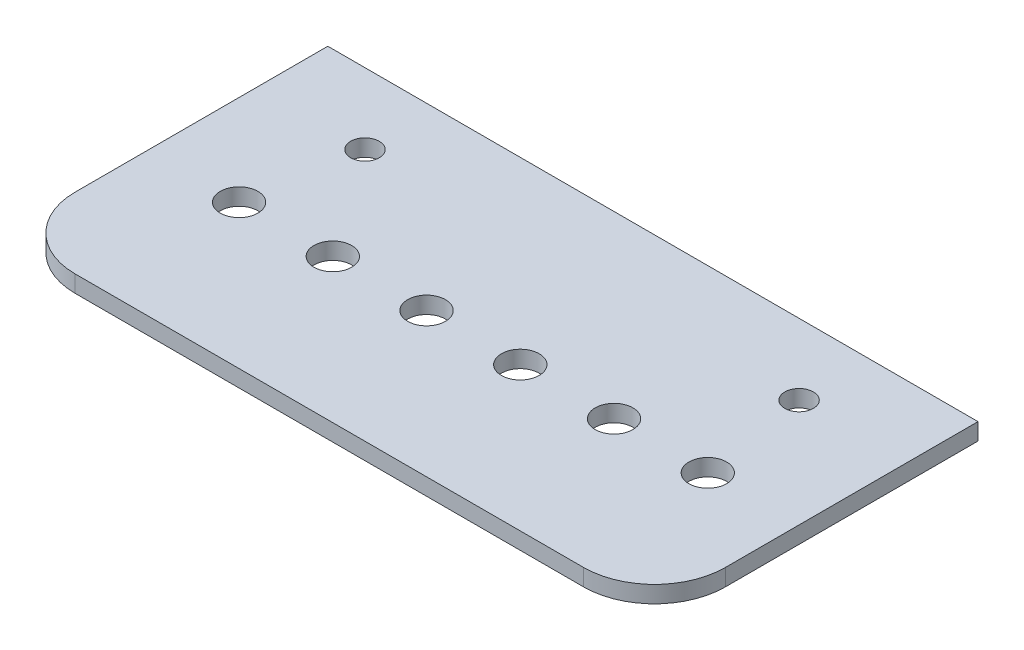
ISO-10303-21;
HEADER;
FILE_DESCRIPTION(('STEP AP214'),'2;1');
FILE_NAME('part.step','',(''),(''),'','','');
FILE_SCHEMA(('AUTOMOTIVE_DESIGN { 1 0 10303 214 1 1 1 1 }'));
ENDSEC;
DATA;
#1=APPLICATION_CONTEXT('core data for automotive mechanical design processes');
#2=APPLICATION_PROTOCOL_DEFINITION('international standard','automotive_design',2000,#1);
#3=PRODUCT_CONTEXT('',#1,'mechanical');
#4=PRODUCT('Part','Part','',(#3));
#5=PRODUCT_RELATED_PRODUCT_CATEGORY('part','',(#4));
#6=PRODUCT_DEFINITION_FORMATION('','',#4);
#7=PRODUCT_DEFINITION_CONTEXT('part definition',#1,'design');
#8=PRODUCT_DEFINITION('design','',#6,#7);
#9=PRODUCT_DEFINITION_SHAPE('','',#8);
#10=(LENGTH_UNIT() NAMED_UNIT(*) SI_UNIT(.MILLI.,.METRE.));
#11=(NAMED_UNIT(*) PLANE_ANGLE_UNIT() SI_UNIT($,.RADIAN.));
#12=(NAMED_UNIT(*) SI_UNIT($,.STERADIAN.) SOLID_ANGLE_UNIT());
#13=UNCERTAINTY_MEASURE_WITH_UNIT(LENGTH_MEASURE(1.E-05),#10,'distance_accuracy_value','');
#14=(GEOMETRIC_REPRESENTATION_CONTEXT(3) GLOBAL_UNCERTAINTY_ASSIGNED_CONTEXT((#13)) GLOBAL_UNIT_ASSIGNED_CONTEXT((#10,
#11,#12)) REPRESENTATION_CONTEXT('',''));
#15=CARTESIAN_POINT('',(0.,0.,0.));
#16=DIRECTION('',(0.,0.,1.));
#17=DIRECTION('',(1.,0.,0.));
#18=AXIS2_PLACEMENT_3D('',#15,#16,#17);
#19=CARTESIAN_POINT('',(44.475,2.95,-12.4));
#20=DIRECTION('',(0.,-1.,0.));
#21=DIRECTION('',(0.,0.,-1.));
#22=AXIS2_PLACEMENT_3D('',#19,#20,#21);
#23=CYLINDRICAL_SURFACE('',#22,12.4);
#24=CARTESIAN_POINT('',(44.475,0.,-12.4));
#25=DIRECTION('',(0.,1.,0.));
#26=DIRECTION('',(0.,0.,1.));
#27=AXIS2_PLACEMENT_3D('',#24,#25,#26);
#28=CIRCLE('',#27,12.4);
#29=CARTESIAN_POINT('',(44.475,0.,0.));
#30=VERTEX_POINT('',#29);
#31=CARTESIAN_POINT('',(56.875,0.,-12.4));
#32=VERTEX_POINT('',#31);
#33=EDGE_CURVE('E119',#30,#32,#28,.T.);
#34=ORIENTED_EDGE('',*,*,#33,.T.);
#35=DIRECTION('',(0.,-1.,0.));
#36=VECTOR('',#35,1.);
#37=CARTESIAN_POINT('',(56.875,2.95,-12.4));
#38=LINE('',#37,#36);
#39=CARTESIAN_POINT('',(56.875,2.95,-12.4));
#40=VERTEX_POINT('',#39);
#41=EDGE_CURVE('E11',#40,#32,#38,.T.);
#42=ORIENTED_EDGE('',*,*,#41,.F.);
#43=CARTESIAN_POINT('',(44.475,2.95,-12.4));
#44=DIRECTION('',(0.,1.,0.));
#45=DIRECTION('',(0.,0.,1.));
#46=AXIS2_PLACEMENT_3D('',#43,#44,#45);
#47=CIRCLE('',#46,12.4);
#48=CARTESIAN_POINT('',(44.475,2.95,0.));
#49=VERTEX_POINT('',#48);
#50=EDGE_CURVE('E130',#49,#40,#47,.T.);
#51=ORIENTED_EDGE('',*,*,#50,.F.);
#52=DIRECTION('',(0.,-1.,0.));
#53=VECTOR('',#52,1.);
#54=CARTESIAN_POINT('',(44.475,2.95,0.));
#55=LINE('',#54,#53);
#56=EDGE_CURVE('E115',#49,#30,#55,.T.);
#57=ORIENTED_EDGE('',*,*,#56,.T.);
#58=EDGE_LOOP('',(#34,#42,#51,#57));
#59=FACE_BOUND('',#58,.T.);
#60=ADVANCED_FACE('F35',(#59),#23,.T.);
#61=CARTESIAN_POINT('',(56.875,2.95,-12.4));
#62=DIRECTION('',(-1.,0.,0.));
#63=DIRECTION('',(0.,0.,1.));
#64=AXIS2_PLACEMENT_3D('',#61,#62,#63);
#65=PLANE('',#64);
#66=DIRECTION('',(0.,0.,-1.));
#67=VECTOR('',#66,1.);
#68=CARTESIAN_POINT('',(56.875,0.,-12.4));
#69=LINE('',#68,#67);
#70=CARTESIAN_POINT('',(56.875,0.,-56.6));
#71=VERTEX_POINT('',#70);
#72=EDGE_CURVE('E122',#32,#71,#69,.T.);
#73=ORIENTED_EDGE('',*,*,#72,.T.);
#74=DIRECTION('',(0.,-1.,0.));
#75=VECTOR('',#74,1.);
#76=CARTESIAN_POINT('',(56.875,2.95,-56.6));
#77=LINE('',#76,#75);
#78=CARTESIAN_POINT('',(56.875,2.95,-56.6));
#79=VERTEX_POINT('',#78);
#80=EDGE_CURVE('E43',#79,#71,#77,.T.);
#81=ORIENTED_EDGE('',*,*,#80,.F.);
#82=DIRECTION('',(0.,0.,-1.));
#83=VECTOR('',#82,1.);
#84=CARTESIAN_POINT('',(56.875,2.95,-12.4));
#85=LINE('',#84,#83);
#86=EDGE_CURVE('E88',#40,#79,#85,.T.);
#87=ORIENTED_EDGE('',*,*,#86,.F.);
#88=ORIENTED_EDGE('',*,*,#41,.T.);
#89=EDGE_LOOP('',(#73,#81,#87,#88));
#90=FACE_BOUND('',#89,.T.);
#91=ADVANCED_FACE('F155',(#90),#65,.F.);
#92=CARTESIAN_POINT('',(56.875,2.95,-56.6));
#93=DIRECTION('',(0.,0.,1.));
#94=DIRECTION('',(1.,0.,0.));
#95=AXIS2_PLACEMENT_3D('',#92,#93,#94);
#96=PLANE('',#95);
#97=DIRECTION('',(-1.,0.,0.));
#98=VECTOR('',#97,1.);
#99=CARTESIAN_POINT('',(56.875,0.,-56.6));
#100=LINE('',#99,#98);
#101=CARTESIAN_POINT('',(-56.875,0.,-56.6));
#102=VERTEX_POINT('',#101);
#103=EDGE_CURVE('E125',#71,#102,#100,.T.);
#104=ORIENTED_EDGE('',*,*,#103,.T.);
#105=DIRECTION('',(0.,-1.,0.));
#106=VECTOR('',#105,1.);
#107=CARTESIAN_POINT('',(-56.875,2.95,-56.6));
#108=LINE('',#107,#106);
#109=CARTESIAN_POINT('',(-56.875,2.95,-56.6));
#110=VERTEX_POINT('',#109);
#111=EDGE_CURVE('E110',#110,#102,#108,.T.);
#112=ORIENTED_EDGE('',*,*,#111,.F.);
#113=DIRECTION('',(-1.,0.,0.));
#114=VECTOR('',#113,1.);
#115=CARTESIAN_POINT('',(56.875,2.95,-56.6));
#116=LINE('',#115,#114);
#117=EDGE_CURVE('E101',#79,#110,#116,.T.);
#118=ORIENTED_EDGE('',*,*,#117,.F.);
#119=ORIENTED_EDGE('',*,*,#80,.T.);
#120=EDGE_LOOP('',(#104,#112,#118,#119));
#121=FACE_BOUND('',#120,.T.);
#122=ADVANCED_FACE('F136',(#121),#96,.F.);
#123=CARTESIAN_POINT('',(-56.875,2.95,-56.6));
#124=DIRECTION('',(1.,0.,0.));
#125=DIRECTION('',(0.,0.,-1.));
#126=AXIS2_PLACEMENT_3D('',#123,#124,#125);
#127=PLANE('',#126);
#128=DIRECTION('',(0.,0.,1.));
#129=VECTOR('',#128,1.);
#130=CARTESIAN_POINT('',(-56.875,0.,-56.6));
#131=LINE('',#130,#129);
#132=CARTESIAN_POINT('',(-56.875,0.,-12.4));
#133=VERTEX_POINT('',#132);
#134=EDGE_CURVE('E109',#102,#133,#131,.T.);
#135=ORIENTED_EDGE('',*,*,#134,.T.);
#136=DIRECTION('',(0.,-1.,0.));
#137=VECTOR('',#136,1.);
#138=CARTESIAN_POINT('',(-56.875,2.95,-12.4));
#139=LINE('',#138,#137);
#140=CARTESIAN_POINT('',(-56.875,2.95,-12.4));
#141=VERTEX_POINT('',#140);
#142=EDGE_CURVE('E106',#141,#133,#139,.T.);
#143=ORIENTED_EDGE('',*,*,#142,.F.);
#144=DIRECTION('',(0.,0.,1.));
#145=VECTOR('',#144,1.);
#146=CARTESIAN_POINT('',(-56.875,2.95,-56.6));
#147=LINE('',#146,#145);
#148=EDGE_CURVE('E95',#110,#141,#147,.T.);
#149=ORIENTED_EDGE('',*,*,#148,.F.);
#150=ORIENTED_EDGE('',*,*,#111,.T.);
#151=EDGE_LOOP('',(#135,#143,#149,#150));
#152=FACE_BOUND('',#151,.T.);
#153=ADVANCED_FACE('F107',(#152),#127,.F.);
#154=CARTESIAN_POINT('',(-44.475,2.95,-12.4));
#155=DIRECTION('',(0.,-1.,0.));
#156=DIRECTION('',(0.,0.,-1.));
#157=AXIS2_PLACEMENT_3D('',#154,#155,#156);
#158=CYLINDRICAL_SURFACE('',#157,12.4);
#159=CARTESIAN_POINT('',(-44.475,0.,-12.4));
#160=DIRECTION('',(0.,1.,0.));
#161=DIRECTION('',(0.,0.,1.));
#162=AXIS2_PLACEMENT_3D('',#159,#160,#161);
#163=CIRCLE('',#162,12.4);
#164=CARTESIAN_POINT('',(-44.475,0.,0.));
#165=VERTEX_POINT('',#164);
#166=EDGE_CURVE('E74',#133,#165,#163,.T.);
#167=ORIENTED_EDGE('',*,*,#166,.T.);
#168=DIRECTION('',(0.,-1.,0.));
#169=VECTOR('',#168,1.);
#170=CARTESIAN_POINT('',(-44.475,2.95,0.));
#171=LINE('',#170,#169);
#172=CARTESIAN_POINT('',(-44.475,2.95,0.));
#173=VERTEX_POINT('',#172);
#174=EDGE_CURVE('E111',#173,#165,#171,.T.);
#175=ORIENTED_EDGE('',*,*,#174,.F.);
#176=CARTESIAN_POINT('',(-44.475,2.95,-12.4));
#177=DIRECTION('',(0.,1.,0.));
#178=DIRECTION('',(0.,0.,1.));
#179=AXIS2_PLACEMENT_3D('',#176,#177,#178);
#180=CIRCLE('',#179,12.4);
#181=EDGE_CURVE('E99',#141,#173,#180,.T.);
#182=ORIENTED_EDGE('',*,*,#181,.F.);
#183=ORIENTED_EDGE('',*,*,#142,.T.);
#184=EDGE_LOOP('',(#167,#175,#182,#183));
#185=FACE_BOUND('',#184,.T.);
#186=ADVANCED_FACE('F113',(#185),#158,.T.);
#187=CARTESIAN_POINT('',(-44.475,2.95,0.));
#188=DIRECTION('',(0.,0.,-1.));
#189=DIRECTION('',(-1.,0.,0.));
#190=AXIS2_PLACEMENT_3D('',#187,#188,#189);
#191=PLANE('',#190);
#192=DIRECTION('',(1.,0.,0.));
#193=VECTOR('',#192,1.);
#194=CARTESIAN_POINT('',(-44.475,0.,0.));
#195=LINE('',#194,#193);
#196=EDGE_CURVE('E80',#165,#30,#195,.T.);
#197=ORIENTED_EDGE('',*,*,#196,.T.);
#198=ORIENTED_EDGE('',*,*,#56,.F.);
#199=DIRECTION('',(1.,0.,0.));
#200=VECTOR('',#199,1.);
#201=CARTESIAN_POINT('',(-44.475,2.95,0.));
#202=LINE('',#201,#200);
#203=EDGE_CURVE('E51',#173,#49,#202,.T.);
#204=ORIENTED_EDGE('',*,*,#203,.F.);
#205=ORIENTED_EDGE('',*,*,#174,.T.);
#206=EDGE_LOOP('',(#197,#198,#204,#205));
#207=FACE_BOUND('',#206,.T.);
#208=ADVANCED_FACE('F143',(#207),#191,.F.);
#209=CARTESIAN_POINT('',(44.475,2.95,-12.4));
#210=DIRECTION('',(0.,1.,0.));
#211=DIRECTION('',(0.,0.,1.));
#212=AXIS2_PLACEMENT_3D('',#209,#210,#211);
#213=PLANE('',#212);
#214=CARTESIAN_POINT('',(37.975,2.95,-44.2));
#215=DIRECTION('',(0.,-1.,0.));
#216=DIRECTION('',(0.,0.,1.));
#217=AXIS2_PLACEMENT_3D('',#214,#215,#216);
#218=CIRCLE('',#217,2.5);
#219=CARTESIAN_POINT('',(37.975,2.95,-41.7));
#220=VERTEX_POINT('',#219);
#221=EDGE_CURVE('E281',#220,#220,#218,.T.);
#222=ORIENTED_EDGE('',*,*,#221,.T.);
#223=EDGE_LOOP('',(#222));
#224=FACE_BOUND('',#223,.T.);
#225=CARTESIAN_POINT('',(-37.975,2.95,-44.2));
#226=DIRECTION('',(0.,1.,0.));
#227=DIRECTION('',(0.,0.,1.));
#228=AXIS2_PLACEMENT_3D('',#225,#226,#227);
#229=CIRCLE('',#228,2.5);
#230=CARTESIAN_POINT('',(-37.975,2.95,-41.7));
#231=VERTEX_POINT('',#230);
#232=EDGE_CURVE('E283',#231,#231,#229,.T.);
#233=ORIENTED_EDGE('',*,*,#232,.F.);
#234=EDGE_LOOP('',(#233));
#235=FACE_BOUND('',#234,.T.);
#236=CARTESIAN_POINT('',(-41.,2.95,-25.2));
#237=DIRECTION('',(0.,1.,0.));
#238=DIRECTION('',(0.,0.,1.));
#239=AXIS2_PLACEMENT_3D('',#236,#237,#238);
#240=CIRCLE('',#239,3.3);
#241=CARTESIAN_POINT('',(-41.,2.95,-21.9));
#242=VERTEX_POINT('',#241);
#243=EDGE_CURVE('E294',#242,#242,#240,.T.);
#244=ORIENTED_EDGE('',*,*,#243,.F.);
#245=EDGE_LOOP('',(#244));
#246=FACE_BOUND('',#245,.T.);
#247=CARTESIAN_POINT('',(-24.6,2.95,-25.2));
#248=DIRECTION('',(0.,1.,0.));
#249=DIRECTION('',(0.,0.,1.));
#250=AXIS2_PLACEMENT_3D('',#247,#248,#249);
#251=CIRCLE('',#250,3.3);
#252=CARTESIAN_POINT('',(-24.6,2.95,-21.9));
#253=VERTEX_POINT('',#252);
#254=EDGE_CURVE('E300',#253,#253,#251,.T.);
#255=ORIENTED_EDGE('',*,*,#254,.F.);
#256=EDGE_LOOP('',(#255));
#257=FACE_BOUND('',#256,.T.);
#258=CARTESIAN_POINT('',(-8.2,2.95,-25.2));
#259=DIRECTION('',(0.,1.,0.));
#260=DIRECTION('',(0.,0.,1.));
#261=AXIS2_PLACEMENT_3D('',#258,#259,#260);
#262=CIRCLE('',#261,3.3);
#263=CARTESIAN_POINT('',(-8.2,2.95,-21.9));
#264=VERTEX_POINT('',#263);
#265=EDGE_CURVE('E306',#264,#264,#262,.T.);
#266=ORIENTED_EDGE('',*,*,#265,.F.);
#267=EDGE_LOOP('',(#266));
#268=FACE_BOUND('',#267,.T.);
#269=CARTESIAN_POINT('',(8.2,2.95,-25.2));
#270=DIRECTION('',(0.,1.,0.));
#271=DIRECTION('',(0.,0.,1.));
#272=AXIS2_PLACEMENT_3D('',#269,#270,#271);
#273=CIRCLE('',#272,3.3);
#274=CARTESIAN_POINT('',(8.2,2.95,-21.9));
#275=VERTEX_POINT('',#274);
#276=EDGE_CURVE('E312',#275,#275,#273,.T.);
#277=ORIENTED_EDGE('',*,*,#276,.F.);
#278=EDGE_LOOP('',(#277));
#279=FACE_BOUND('',#278,.T.);
#280=CARTESIAN_POINT('',(24.6,2.95,-25.2));
#281=DIRECTION('',(0.,1.,0.));
#282=DIRECTION('',(0.,0.,1.));
#283=AXIS2_PLACEMENT_3D('',#280,#281,#282);
#284=CIRCLE('',#283,3.3);
#285=CARTESIAN_POINT('',(24.6,2.95,-21.9));
#286=VERTEX_POINT('',#285);
#287=EDGE_CURVE('E318',#286,#286,#284,.T.);
#288=ORIENTED_EDGE('',*,*,#287,.F.);
#289=EDGE_LOOP('',(#288));
#290=FACE_BOUND('',#289,.T.);
#291=CARTESIAN_POINT('',(41.,2.95,-25.2));
#292=DIRECTION('',(0.,1.,0.));
#293=DIRECTION('',(0.,0.,1.));
#294=AXIS2_PLACEMENT_3D('',#291,#292,#293);
#295=CIRCLE('',#294,3.3);
#296=CARTESIAN_POINT('',(41.,2.95,-21.9));
#297=VERTEX_POINT('',#296);
#298=EDGE_CURVE('E289',#297,#297,#295,.T.);
#299=ORIENTED_EDGE('',*,*,#298,.F.);
#300=EDGE_LOOP('',(#299));
#301=FACE_BOUND('',#300,.T.);
#302=ORIENTED_EDGE('',*,*,#50,.T.);
#303=ORIENTED_EDGE('',*,*,#86,.T.);
#304=ORIENTED_EDGE('',*,*,#117,.T.);
#305=ORIENTED_EDGE('',*,*,#148,.T.);
#306=ORIENTED_EDGE('',*,*,#181,.T.);
#307=ORIENTED_EDGE('',*,*,#203,.T.);
#308=EDGE_LOOP('',(#302,#303,#304,#305,#306,#307));
#309=FACE_BOUND('',#308,.T.);
#310=ADVANCED_FACE('F97',(#224,#235,#246,#257,#268,#279,#290,#301,#309),#213,.T.);
#311=CARTESIAN_POINT('',(44.475,0.,-12.4));
#312=DIRECTION('',(0.,1.,0.));
#313=DIRECTION('',(0.,0.,1.));
#314=AXIS2_PLACEMENT_3D('',#311,#312,#313);
#315=PLANE('',#314);
#316=CARTESIAN_POINT('',(37.975,0.,-44.2));
#317=DIRECTION('',(0.,-1.,0.));
#318=DIRECTION('',(0.,0.,1.));
#319=AXIS2_PLACEMENT_3D('',#316,#317,#318);
#320=CIRCLE('',#319,2.5);
#321=CARTESIAN_POINT('',(37.975,0.,-41.7));
#322=VERTEX_POINT('',#321);
#323=EDGE_CURVE('E278',#322,#322,#320,.T.);
#324=ORIENTED_EDGE('',*,*,#323,.F.);
#325=EDGE_LOOP('',(#324));
#326=FACE_BOUND('',#325,.T.);
#327=CARTESIAN_POINT('',(-37.975,0.,-44.2));
#328=DIRECTION('',(0.,1.,0.));
#329=DIRECTION('',(0.,0.,1.));
#330=AXIS2_PLACEMENT_3D('',#327,#328,#329);
#331=CIRCLE('',#330,2.5);
#332=CARTESIAN_POINT('',(-37.975,0.,-41.7));
#333=VERTEX_POINT('',#332);
#334=EDGE_CURVE('E286',#333,#333,#331,.T.);
#335=ORIENTED_EDGE('',*,*,#334,.T.);
#336=EDGE_LOOP('',(#335));
#337=FACE_BOUND('',#336,.T.);
#338=CARTESIAN_POINT('',(-41.,0.,-25.2));
#339=DIRECTION('',(0.,1.,0.));
#340=DIRECTION('',(0.,0.,1.));
#341=AXIS2_PLACEMENT_3D('',#338,#339,#340);
#342=CIRCLE('',#341,3.3);
#343=CARTESIAN_POINT('',(-41.,0.,-21.9));
#344=VERTEX_POINT('',#343);
#345=EDGE_CURVE('E123',#344,#344,#342,.T.);
#346=ORIENTED_EDGE('',*,*,#345,.T.);
#347=EDGE_LOOP('',(#346));
#348=FACE_BOUND('',#347,.T.);
#349=CARTESIAN_POINT('',(-24.6,0.,-25.2));
#350=DIRECTION('',(0.,1.,0.));
#351=DIRECTION('',(0.,0.,1.));
#352=AXIS2_PLACEMENT_3D('',#349,#350,#351);
#353=CIRCLE('',#352,3.3);
#354=CARTESIAN_POINT('',(-24.6,0.,-21.9));
#355=VERTEX_POINT('',#354);
#356=EDGE_CURVE('E297',#355,#355,#353,.T.);
#357=ORIENTED_EDGE('',*,*,#356,.T.);
#358=EDGE_LOOP('',(#357));
#359=FACE_BOUND('',#358,.T.);
#360=CARTESIAN_POINT('',(-8.2,0.,-25.2));
#361=DIRECTION('',(0.,1.,0.));
#362=DIRECTION('',(0.,0.,1.));
#363=AXIS2_PLACEMENT_3D('',#360,#361,#362);
#364=CIRCLE('',#363,3.3);
#365=CARTESIAN_POINT('',(-8.2,0.,-21.9));
#366=VERTEX_POINT('',#365);
#367=EDGE_CURVE('E303',#366,#366,#364,.T.);
#368=ORIENTED_EDGE('',*,*,#367,.T.);
#369=EDGE_LOOP('',(#368));
#370=FACE_BOUND('',#369,.T.);
#371=CARTESIAN_POINT('',(8.2,0.,-25.2));
#372=DIRECTION('',(0.,1.,0.));
#373=DIRECTION('',(0.,0.,1.));
#374=AXIS2_PLACEMENT_3D('',#371,#372,#373);
#375=CIRCLE('',#374,3.3);
#376=CARTESIAN_POINT('',(8.2,0.,-21.9));
#377=VERTEX_POINT('',#376);
#378=EDGE_CURVE('E309',#377,#377,#375,.T.);
#379=ORIENTED_EDGE('',*,*,#378,.T.);
#380=EDGE_LOOP('',(#379));
#381=FACE_BOUND('',#380,.T.);
#382=CARTESIAN_POINT('',(24.6,0.,-25.2));
#383=DIRECTION('',(0.,1.,0.));
#384=DIRECTION('',(0.,0.,1.));
#385=AXIS2_PLACEMENT_3D('',#382,#383,#384);
#386=CIRCLE('',#385,3.3);
#387=CARTESIAN_POINT('',(24.6,0.,-21.9));
#388=VERTEX_POINT('',#387);
#389=EDGE_CURVE('E315',#388,#388,#386,.T.);
#390=ORIENTED_EDGE('',*,*,#389,.T.);
#391=EDGE_LOOP('',(#390));
#392=FACE_BOUND('',#391,.T.);
#393=CARTESIAN_POINT('',(41.,0.,-25.2));
#394=DIRECTION('',(0.,1.,0.));
#395=DIRECTION('',(0.,0.,1.));
#396=AXIS2_PLACEMENT_3D('',#393,#394,#395);
#397=CIRCLE('',#396,3.3);
#398=CARTESIAN_POINT('',(41.,0.,-21.9));
#399=VERTEX_POINT('',#398);
#400=EDGE_CURVE('E321',#399,#399,#397,.T.);
#401=ORIENTED_EDGE('',*,*,#400,.T.);
#402=EDGE_LOOP('',(#401));
#403=FACE_BOUND('',#402,.T.);
#404=ORIENTED_EDGE('',*,*,#33,.F.);
#405=ORIENTED_EDGE('',*,*,#196,.F.);
#406=ORIENTED_EDGE('',*,*,#166,.F.);
#407=ORIENTED_EDGE('',*,*,#134,.F.);
#408=ORIENTED_EDGE('',*,*,#103,.F.);
#409=ORIENTED_EDGE('',*,*,#72,.F.);
#410=EDGE_LOOP('',(#404,#405,#406,#407,#408,#409));
#411=FACE_BOUND('',#410,.T.);
#412=ADVANCED_FACE('F139',(#326,#337,#348,#359,#370,#381,#392,#403,#411),#315,.F.);
#413=CARTESIAN_POINT('',(41.,0.,-25.2));
#414=DIRECTION('',(0.,1.,0.));
#415=DIRECTION('',(0.,0.,1.));
#416=AXIS2_PLACEMENT_3D('',#413,#414,#415);
#417=CYLINDRICAL_SURFACE('',#416,3.3);
#418=ORIENTED_EDGE('',*,*,#400,.F.);
#419=EDGE_LOOP('',(#418));
#420=FACE_BOUND('',#419,.T.);
#421=ORIENTED_EDGE('',*,*,#298,.T.);
#422=EDGE_LOOP('',(#421));
#423=FACE_BOUND('',#422,.T.);
#424=ADVANCED_FACE('F183',(#420,#423),#417,.F.);
#425=CARTESIAN_POINT('',(24.6,0.,-25.2));
#426=DIRECTION('',(0.,1.,0.));
#427=DIRECTION('',(0.,0.,1.));
#428=AXIS2_PLACEMENT_3D('',#425,#426,#427);
#429=CYLINDRICAL_SURFACE('',#428,3.3);
#430=ORIENTED_EDGE('',*,*,#389,.F.);
#431=EDGE_LOOP('',(#430));
#432=FACE_BOUND('',#431,.T.);
#433=ORIENTED_EDGE('',*,*,#287,.T.);
#434=EDGE_LOOP('',(#433));
#435=FACE_BOUND('',#434,.T.);
#436=ADVANCED_FACE('F188',(#432,#435),#429,.F.);
#437=CARTESIAN_POINT('',(8.2,0.,-25.2));
#438=DIRECTION('',(0.,1.,0.));
#439=DIRECTION('',(0.,0.,1.));
#440=AXIS2_PLACEMENT_3D('',#437,#438,#439);
#441=CYLINDRICAL_SURFACE('',#440,3.3);
#442=ORIENTED_EDGE('',*,*,#378,.F.);
#443=EDGE_LOOP('',(#442));
#444=FACE_BOUND('',#443,.T.);
#445=ORIENTED_EDGE('',*,*,#276,.T.);
#446=EDGE_LOOP('',(#445));
#447=FACE_BOUND('',#446,.T.);
#448=ADVANCED_FACE('F200',(#444,#447),#441,.F.);
#449=CARTESIAN_POINT('',(-8.2,0.,-25.2));
#450=DIRECTION('',(0.,1.,0.));
#451=DIRECTION('',(0.,0.,1.));
#452=AXIS2_PLACEMENT_3D('',#449,#450,#451);
#453=CYLINDRICAL_SURFACE('',#452,3.3);
#454=ORIENTED_EDGE('',*,*,#367,.F.);
#455=EDGE_LOOP('',(#454));
#456=FACE_BOUND('',#455,.T.);
#457=ORIENTED_EDGE('',*,*,#265,.T.);
#458=EDGE_LOOP('',(#457));
#459=FACE_BOUND('',#458,.T.);
#460=ADVANCED_FACE('F210',(#456,#459),#453,.F.);
#461=CARTESIAN_POINT('',(-24.6,0.,-25.2));
#462=DIRECTION('',(0.,1.,0.));
#463=DIRECTION('',(0.,0.,1.));
#464=AXIS2_PLACEMENT_3D('',#461,#462,#463);
#465=CYLINDRICAL_SURFACE('',#464,3.3);
#466=ORIENTED_EDGE('',*,*,#356,.F.);
#467=EDGE_LOOP('',(#466));
#468=FACE_BOUND('',#467,.T.);
#469=ORIENTED_EDGE('',*,*,#254,.T.);
#470=EDGE_LOOP('',(#469));
#471=FACE_BOUND('',#470,.T.);
#472=ADVANCED_FACE('F220',(#468,#471),#465,.F.);
#473=CARTESIAN_POINT('',(-41.,0.,-25.2));
#474=DIRECTION('',(0.,1.,0.));
#475=DIRECTION('',(0.,0.,1.));
#476=AXIS2_PLACEMENT_3D('',#473,#474,#475);
#477=CYLINDRICAL_SURFACE('',#476,3.3);
#478=ORIENTED_EDGE('',*,*,#345,.F.);
#479=EDGE_LOOP('',(#478));
#480=FACE_BOUND('',#479,.T.);
#481=ORIENTED_EDGE('',*,*,#243,.T.);
#482=EDGE_LOOP('',(#481));
#483=FACE_BOUND('',#482,.T.);
#484=ADVANCED_FACE('F230',(#480,#483),#477,.F.);
#485=CARTESIAN_POINT('',(-37.975,0.,-44.2));
#486=DIRECTION('',(0.,1.,0.));
#487=DIRECTION('',(0.,0.,1.));
#488=AXIS2_PLACEMENT_3D('',#485,#486,#487);
#489=CYLINDRICAL_SURFACE('',#488,2.5);
#490=ORIENTED_EDGE('',*,*,#334,.F.);
#491=EDGE_LOOP('',(#490));
#492=FACE_BOUND('',#491,.T.);
#493=ORIENTED_EDGE('',*,*,#232,.T.);
#494=EDGE_LOOP('',(#493));
#495=FACE_BOUND('',#494,.T.);
#496=ADVANCED_FACE('F240',(#492,#495),#489,.F.);
#497=CARTESIAN_POINT('',(37.975,0.,-44.2));
#498=DIRECTION('',(0.,1.,0.));
#499=DIRECTION('',(0.,0.,1.));
#500=AXIS2_PLACEMENT_3D('',#497,#498,#499);
#501=CYLINDRICAL_SURFACE('',#500,2.5);
#502=ORIENTED_EDGE('',*,*,#323,.T.);
#503=EDGE_LOOP('',(#502));
#504=FACE_BOUND('',#503,.T.);
#505=ORIENTED_EDGE('',*,*,#221,.F.);
#506=EDGE_LOOP('',(#505));
#507=FACE_BOUND('',#506,.T.);
#508=ADVANCED_FACE('F250',(#504,#507),#501,.F.);
#509=CLOSED_SHELL('',(#60,#91,#122,#153,#186,#208,#310,#412,#424,#436,#448,#460,#472,#484,#496,#508));
#510=MANIFOLD_SOLID_BREP('B2',#509);
#511=ADVANCED_BREP_SHAPE_REPRESENTATION('',(#18,#510),#14);
#512=SHAPE_DEFINITION_REPRESENTATION(#9,#511);
ENDSEC;
END-ISO-10303-21;
